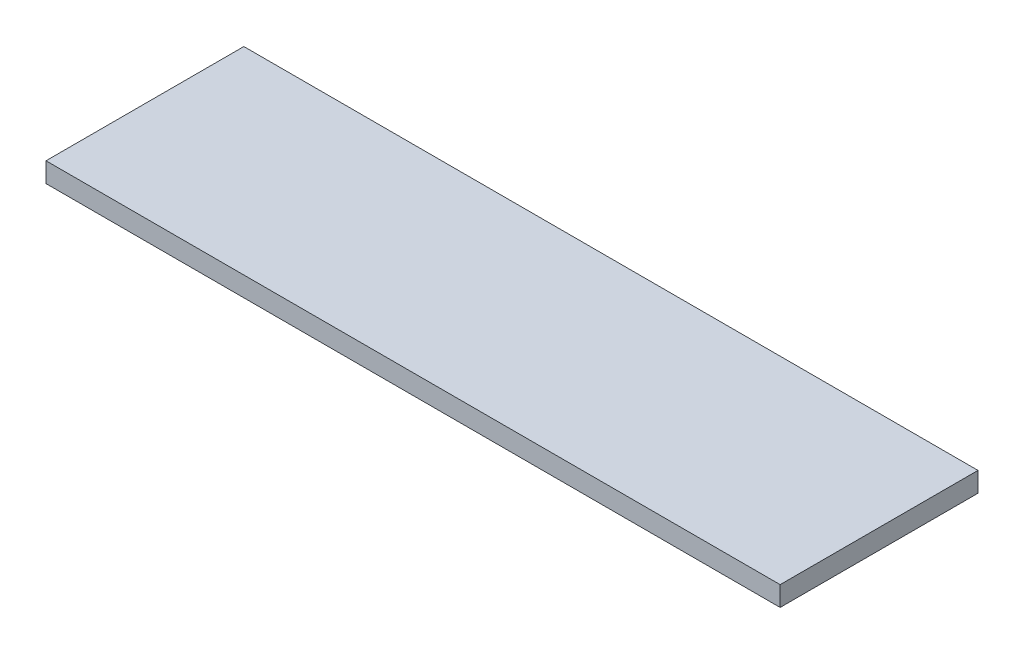
ISO-10303-21;
HEADER;
FILE_DESCRIPTION(('STEP AP214'),'2;1');
FILE_NAME('part.step','',(''),(''),'','','');
FILE_SCHEMA(('AUTOMOTIVE_DESIGN { 1 0 10303 214 1 1 1 1 }'));
ENDSEC;
DATA;
#1=APPLICATION_CONTEXT('core data for automotive mechanical design processes');
#2=APPLICATION_PROTOCOL_DEFINITION('international standard','automotive_design',2000,#1);
#3=PRODUCT_CONTEXT('',#1,'mechanical');
#4=PRODUCT('Part','Part','',(#3));
#5=PRODUCT_RELATED_PRODUCT_CATEGORY('part','',(#4));
#6=PRODUCT_DEFINITION_FORMATION('','',#4);
#7=PRODUCT_DEFINITION_CONTEXT('part definition',#1,'design');
#8=PRODUCT_DEFINITION('design','',#6,#7);
#9=PRODUCT_DEFINITION_SHAPE('','',#8);
#10=(LENGTH_UNIT() NAMED_UNIT(*) SI_UNIT(.MILLI.,.METRE.));
#11=(NAMED_UNIT(*) PLANE_ANGLE_UNIT() SI_UNIT($,.RADIAN.));
#12=(NAMED_UNIT(*) SI_UNIT($,.STERADIAN.) SOLID_ANGLE_UNIT());
#13=UNCERTAINTY_MEASURE_WITH_UNIT(LENGTH_MEASURE(1.E-05),#10,'distance_accuracy_value','');
#14=(GEOMETRIC_REPRESENTATION_CONTEXT(3) GLOBAL_UNCERTAINTY_ASSIGNED_CONTEXT((#13)) GLOBAL_UNIT_ASSIGNED_CONTEXT((#10,
#11,#12)) REPRESENTATION_CONTEXT('',''));
#15=CARTESIAN_POINT('',(0.,0.,0.));
#16=DIRECTION('',(0.,0.,1.));
#17=DIRECTION('',(1.,0.,0.));
#18=AXIS2_PLACEMENT_3D('',#15,#16,#17);
#19=CARTESIAN_POINT('',(-150.628547233686,4.,56.5202333043868));
#20=DIRECTION('',(0.,0.,-1.));
#21=DIRECTION('',(-1.,0.,0.));
#22=AXIS2_PLACEMENT_3D('',#19,#20,#21);
#23=PLANE('',#22);
#24=DIRECTION('',(1.,0.,0.));
#25=VECTOR('',#24,1.);
#26=CARTESIAN_POINT('',(-150.628547233686,4.,56.5202333043868));
#27=LINE('',#26,#25);
#28=CARTESIAN_POINT('',(-49.0498051256079,4.,56.5202333043868));
#29=VERTEX_POINT('',#28);
#30=CARTESIAN_POINT('',(99.3714527663138,4.,56.5202333043868));
#31=VERTEX_POINT('',#30);
#32=EDGE_CURVE('E88',#29,#31,#27,.T.);
#33=ORIENTED_EDGE('',*,*,#32,.F.);
#34=DIRECTION('',(0.,-1.,0.));
#35=VECTOR('',#34,1.);
#36=CARTESIAN_POINT('',(-49.0498051256079,4.,56.5202333043868));
#37=LINE('',#36,#35);
#38=CARTESIAN_POINT('',(-49.0498051256079,0.,56.5202333043868));
#39=VERTEX_POINT('',#38);
#40=EDGE_CURVE('E93',#29,#39,#37,.T.);
#41=ORIENTED_EDGE('',*,*,#40,.T.);
#42=DIRECTION('',(1.,0.,0.));
#43=VECTOR('',#42,1.);
#44=CARTESIAN_POINT('',(-150.628547233686,0.,56.5202333043868));
#45=LINE('',#44,#43);
#46=CARTESIAN_POINT('',(99.3714527663138,0.,56.5202333043868));
#47=VERTEX_POINT('',#46);
#48=EDGE_CURVE('E80',#39,#47,#45,.T.);
#49=ORIENTED_EDGE('',*,*,#48,.T.);
#50=DIRECTION('',(0.,-1.,0.));
#51=VECTOR('',#50,1.);
#52=CARTESIAN_POINT('',(99.3714527663138,4.,56.5202333043868));
#53=LINE('',#52,#51);
#54=EDGE_CURVE('E42',#31,#47,#53,.T.);
#55=ORIENTED_EDGE('',*,*,#54,.F.);
#56=EDGE_LOOP('',(#33,#41,#49,#55));
#57=FACE_BOUND('',#56,.T.);
#58=ADVANCED_FACE('F35',(#57),#23,.F.);
#59=CARTESIAN_POINT('',(99.3714527663138,4.,16.5202333043868));
#60=DIRECTION('',(-1.,0.,0.));
#61=DIRECTION('',(0.,0.,1.));
#62=AXIS2_PLACEMENT_3D('',#59,#60,#61);
#63=PLANE('',#62);
#64=DIRECTION('',(0.,0.,-1.));
#65=VECTOR('',#64,1.);
#66=CARTESIAN_POINT('',(99.3714527663138,0.,16.5202333043868));
#67=LINE('',#66,#65);
#68=CARTESIAN_POINT('',(99.3714527663138,0.,16.5202333043868));
#69=VERTEX_POINT('',#68);
#70=EDGE_CURVE('E70',#47,#69,#67,.T.);
#71=ORIENTED_EDGE('',*,*,#70,.T.);
#72=DIRECTION('',(0.,-1.,0.));
#73=VECTOR('',#72,1.);
#74=CARTESIAN_POINT('',(99.3714527663138,4.,16.5202333043868));
#75=LINE('',#74,#73);
#76=CARTESIAN_POINT('',(99.3714527663138,4.,16.5202333043868));
#77=VERTEX_POINT('',#76);
#78=EDGE_CURVE('E73',#77,#69,#75,.T.);
#79=ORIENTED_EDGE('',*,*,#78,.F.);
#80=DIRECTION('',(0.,0.,-1.));
#81=VECTOR('',#80,1.);
#82=CARTESIAN_POINT('',(99.3714527663138,4.,16.5202333043868));
#83=LINE('',#82,#81);
#84=EDGE_CURVE('E57',#31,#77,#83,.T.);
#85=ORIENTED_EDGE('',*,*,#84,.F.);
#86=ORIENTED_EDGE('',*,*,#54,.T.);
#87=EDGE_LOOP('',(#71,#79,#85,#86));
#88=FACE_BOUND('',#87,.T.);
#89=ADVANCED_FACE('F72',(#88),#63,.F.);
#90=CARTESIAN_POINT('',(-150.628547233686,4.,16.5202333043868));
#91=DIRECTION('',(0.,0.,1.));
#92=DIRECTION('',(1.,0.,0.));
#93=AXIS2_PLACEMENT_3D('',#90,#91,#92);
#94=PLANE('',#93);
#95=DIRECTION('',(-1.,0.,0.));
#96=VECTOR('',#95,1.);
#97=CARTESIAN_POINT('',(-150.628547233686,0.,16.5202333043868));
#98=LINE('',#97,#96);
#99=CARTESIAN_POINT('',(-49.0498051256079,0.,16.5202333043868));
#100=VERTEX_POINT('',#99);
#101=EDGE_CURVE('E79',#69,#100,#98,.T.);
#102=ORIENTED_EDGE('',*,*,#101,.T.);
#103=DIRECTION('',(0.,1.,0.));
#104=VECTOR('',#103,1.);
#105=CARTESIAN_POINT('',(-49.0498051256079,4.,16.5202333043868));
#106=LINE('',#105,#104);
#107=CARTESIAN_POINT('',(-49.0498051256079,4.,16.5202333043868));
#108=VERTEX_POINT('',#107);
#109=EDGE_CURVE('E49',#100,#108,#106,.T.);
#110=ORIENTED_EDGE('',*,*,#109,.T.);
#111=DIRECTION('',(-1.,0.,0.));
#112=VECTOR('',#111,1.);
#113=CARTESIAN_POINT('',(-150.628547233686,4.,16.5202333043868));
#114=LINE('',#113,#112);
#115=EDGE_CURVE('E85',#77,#108,#114,.T.);
#116=ORIENTED_EDGE('',*,*,#115,.F.);
#117=ORIENTED_EDGE('',*,*,#78,.T.);
#118=EDGE_LOOP('',(#102,#110,#116,#117));
#119=FACE_BOUND('',#118,.T.);
#120=ADVANCED_FACE('F84',(#119),#94,.F.);
#121=CARTESIAN_POINT('',(0.,4.,0.));
#122=DIRECTION('',(0.,1.,0.));
#123=DIRECTION('',(0.,0.,1.));
#124=AXIS2_PLACEMENT_3D('',#121,#122,#123);
#125=PLANE('',#124);
#126=DIRECTION('',(0.,0.,-1.));
#127=VECTOR('',#126,1.);
#128=CARTESIAN_POINT('',(-49.0498051256079,4.,0.));
#129=LINE('',#128,#127);
#130=EDGE_CURVE('E99',#29,#108,#129,.T.);
#131=ORIENTED_EDGE('',*,*,#130,.F.);
#132=ORIENTED_EDGE('',*,*,#32,.T.);
#133=ORIENTED_EDGE('',*,*,#84,.T.);
#134=ORIENTED_EDGE('',*,*,#115,.T.);
#135=EDGE_LOOP('',(#131,#132,#133,#134));
#136=FACE_BOUND('',#135,.T.);
#137=ADVANCED_FACE('F105',(#136),#125,.T.);
#138=CARTESIAN_POINT('',(0.,0.,0.));
#139=DIRECTION('',(0.,1.,0.));
#140=DIRECTION('',(0.,0.,1.));
#141=AXIS2_PLACEMENT_3D('',#138,#139,#140);
#142=PLANE('',#141);
#143=ORIENTED_EDGE('',*,*,#48,.F.);
#144=DIRECTION('',(0.,0.,-1.));
#145=VECTOR('',#144,1.);
#146=CARTESIAN_POINT('',(-49.0498051256079,0.,0.));
#147=LINE('',#146,#145);
#148=EDGE_CURVE('E11',#39,#100,#147,.T.);
#149=ORIENTED_EDGE('',*,*,#148,.T.);
#150=ORIENTED_EDGE('',*,*,#101,.F.);
#151=ORIENTED_EDGE('',*,*,#70,.F.);
#152=EDGE_LOOP('',(#143,#149,#150,#151));
#153=FACE_BOUND('',#152,.T.);
#154=ADVANCED_FACE('F87',(#153),#142,.F.);
#155=CARTESIAN_POINT('',(-49.0498051256079,10.,61.5877936872166));
#156=DIRECTION('',(1.,0.,0.));
#157=DIRECTION('',(0.,0.,-1.));
#158=AXIS2_PLACEMENT_3D('',#155,#156,#157);
#159=PLANE('',#158);
#160=ORIENTED_EDGE('',*,*,#130,.T.);
#161=ORIENTED_EDGE('',*,*,#109,.F.);
#162=ORIENTED_EDGE('',*,*,#148,.F.);
#163=ORIENTED_EDGE('',*,*,#40,.F.);
#164=EDGE_LOOP('',(#160,#161,#162,#163));
#165=FACE_BOUND('',#164,.T.);
#166=ADVANCED_FACE('F102',(#165),#159,.F.);
#167=CLOSED_SHELL('',(#58,#89,#120,#137,#154,#166));
#168=MANIFOLD_SOLID_BREP('B2',#167);
#169=ADVANCED_BREP_SHAPE_REPRESENTATION('',(#18,#168),#14);
#170=SHAPE_DEFINITION_REPRESENTATION(#9,#169);
ENDSEC;
END-ISO-10303-21;
